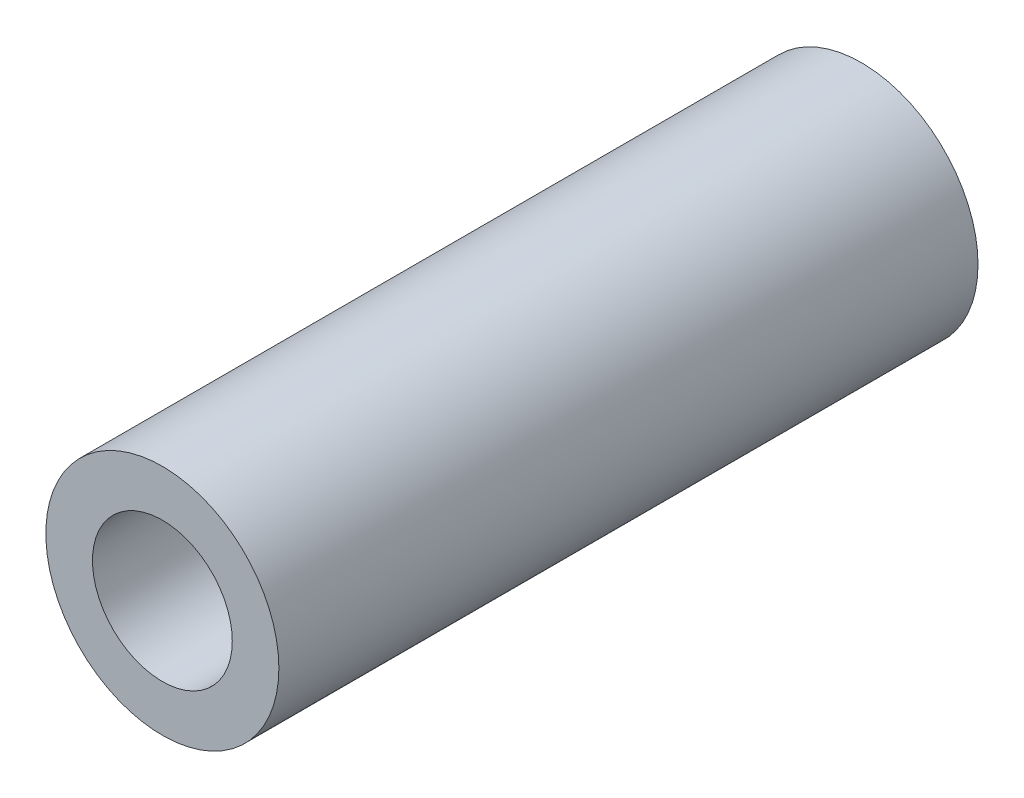
ISO-10303-21;
HEADER;
FILE_DESCRIPTION(('STEP AP214'),'2;1');
FILE_NAME('part.step','',(''),(''),'','','');
FILE_SCHEMA(('AUTOMOTIVE_DESIGN { 1 0 10303 214 1 1 1 1 }'));
ENDSEC;
DATA;
#1=APPLICATION_CONTEXT('core data for automotive mechanical design processes');
#2=APPLICATION_PROTOCOL_DEFINITION('international standard','automotive_design',2000,#1);
#3=PRODUCT_CONTEXT('',#1,'mechanical');
#4=PRODUCT('Part','Part','',(#3));
#5=PRODUCT_RELATED_PRODUCT_CATEGORY('part','',(#4));
#6=PRODUCT_DEFINITION_FORMATION('','',#4);
#7=PRODUCT_DEFINITION_CONTEXT('part definition',#1,'design');
#8=PRODUCT_DEFINITION('design','',#6,#7);
#9=PRODUCT_DEFINITION_SHAPE('','',#8);
#10=(LENGTH_UNIT() NAMED_UNIT(*) SI_UNIT(.MILLI.,.METRE.));
#11=(NAMED_UNIT(*) PLANE_ANGLE_UNIT() SI_UNIT($,.RADIAN.));
#12=(NAMED_UNIT(*) SI_UNIT($,.STERADIAN.) SOLID_ANGLE_UNIT());
#13=UNCERTAINTY_MEASURE_WITH_UNIT(LENGTH_MEASURE(1.E-05),#10,'distance_accuracy_value','');
#14=(GEOMETRIC_REPRESENTATION_CONTEXT(3) GLOBAL_UNCERTAINTY_ASSIGNED_CONTEXT((#13)) GLOBAL_UNIT_ASSIGNED_CONTEXT((#10,
#11,#12)) REPRESENTATION_CONTEXT('',''));
#15=CARTESIAN_POINT('',(0.,0.,0.));
#16=DIRECTION('',(0.,0.,1.));
#17=DIRECTION('',(1.,0.,0.));
#18=AXIS2_PLACEMENT_3D('',#15,#16,#17);
#19=CARTESIAN_POINT('',(0.,0.,7.5));
#20=DIRECTION('',(0.,0.,1.));
#21=DIRECTION('',(1.,0.,0.));
#22=AXIS2_PLACEMENT_3D('',#19,#20,#21);
#23=PLANE('',#22);
#24=CARTESIAN_POINT('',(0.,0.,7.5));
#25=DIRECTION('',(0.,0.,1.));
#26=DIRECTION('',(1.,0.,0.));
#27=AXIS2_PLACEMENT_3D('',#24,#25,#26);
#28=CIRCLE('',#27,2.5);
#29=CARTESIAN_POINT('',(2.5,0.,7.5));
#30=VERTEX_POINT('',#29);
#31=EDGE_CURVE('E10',#30,#30,#28,.T.);
#32=ORIENTED_EDGE('',*,*,#31,.T.);
#33=EDGE_LOOP('',(#32));
#34=FACE_BOUND('',#33,.T.);
#35=CARTESIAN_POINT('',(0.,0.,7.5));
#36=DIRECTION('',(0.,0.,1.));
#37=DIRECTION('',(1.,0.,0.));
#38=AXIS2_PLACEMENT_3D('',#35,#36,#37);
#39=CIRCLE('',#38,1.5);
#40=CARTESIAN_POINT('',(1.5,0.,7.5));
#41=VERTEX_POINT('',#40);
#42=EDGE_CURVE('E42',#41,#41,#39,.T.);
#43=ORIENTED_EDGE('',*,*,#42,.F.);
#44=EDGE_LOOP('',(#43));
#45=FACE_BOUND('',#44,.T.);
#46=ADVANCED_FACE('F31',(#34,#45),#23,.T.);
#47=CARTESIAN_POINT('',(0.,0.,-7.5));
#48=DIRECTION('',(0.,0.,1.));
#49=DIRECTION('',(1.,0.,0.));
#50=AXIS2_PLACEMENT_3D('',#47,#48,#49);
#51=PLANE('',#50);
#52=CARTESIAN_POINT('',(0.,0.,-7.5));
#53=DIRECTION('',(0.,0.,1.));
#54=DIRECTION('',(1.,0.,0.));
#55=AXIS2_PLACEMENT_3D('',#52,#53,#54);
#56=CIRCLE('',#55,2.5);
#57=CARTESIAN_POINT('',(2.5,0.,-7.5));
#58=VERTEX_POINT('',#57);
#59=EDGE_CURVE('E35',#58,#58,#56,.T.);
#60=ORIENTED_EDGE('',*,*,#59,.F.);
#61=EDGE_LOOP('',(#60));
#62=FACE_BOUND('',#61,.T.);
#63=CARTESIAN_POINT('',(0.,0.,-7.5));
#64=DIRECTION('',(0.,0.,1.));
#65=DIRECTION('',(1.,0.,0.));
#66=AXIS2_PLACEMENT_3D('',#63,#64,#65);
#67=CIRCLE('',#66,1.5);
#68=CARTESIAN_POINT('',(1.5,0.,-7.5));
#69=VERTEX_POINT('',#68);
#70=EDGE_CURVE('E44',#69,#69,#67,.T.);
#71=ORIENTED_EDGE('',*,*,#70,.T.);
#72=EDGE_LOOP('',(#71));
#73=FACE_BOUND('',#72,.T.);
#74=ADVANCED_FACE('F54',(#62,#73),#51,.F.);
#75=CARTESIAN_POINT('',(0.,0.,7.5));
#76=DIRECTION('',(0.,0.,-1.));
#77=DIRECTION('',(-1.,0.,0.));
#78=AXIS2_PLACEMENT_3D('',#75,#76,#77);
#79=CYLINDRICAL_SURFACE('',#78,2.5);
#80=ORIENTED_EDGE('',*,*,#31,.F.);
#81=EDGE_LOOP('',(#80));
#82=FACE_BOUND('',#81,.T.);
#83=ORIENTED_EDGE('',*,*,#59,.T.);
#84=EDGE_LOOP('',(#83));
#85=FACE_BOUND('',#84,.T.);
#86=ADVANCED_FACE('F33',(#82,#85),#79,.T.);
#87=CARTESIAN_POINT('',(0.,0.,7.5));
#88=DIRECTION('',(0.,0.,-1.));
#89=DIRECTION('',(-1.,0.,0.));
#90=AXIS2_PLACEMENT_3D('',#87,#88,#89);
#91=CYLINDRICAL_SURFACE('',#90,1.5);
#92=ORIENTED_EDGE('',*,*,#42,.T.);
#93=EDGE_LOOP('',(#92));
#94=FACE_BOUND('',#93,.T.);
#95=ORIENTED_EDGE('',*,*,#70,.F.);
#96=EDGE_LOOP('',(#95));
#97=FACE_BOUND('',#96,.T.);
#98=ADVANCED_FACE('F50',(#94,#97),#91,.F.);
#99=CLOSED_SHELL('',(#46,#74,#86,#98));
#100=MANIFOLD_SOLID_BREP('B2',#99);
#101=ADVANCED_BREP_SHAPE_REPRESENTATION('',(#18,#100),#14);
#102=SHAPE_DEFINITION_REPRESENTATION(#9,#101);
ENDSEC;
END-ISO-10303-21;
